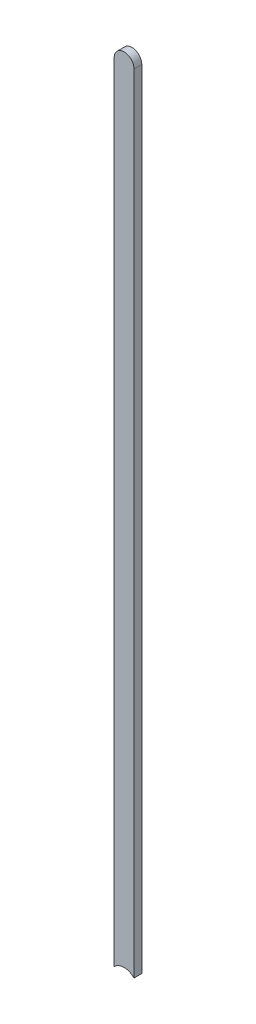
ISO-10303-21;
HEADER;
FILE_DESCRIPTION(('STEP AP214'),'2;1');
FILE_NAME('part.step','',(''),(''),'','','');
FILE_SCHEMA(('AUTOMOTIVE_DESIGN { 1 0 10303 214 1 1 1 1 }'));
ENDSEC;
DATA;
#1=APPLICATION_CONTEXT('core data for automotive mechanical design processes');
#2=APPLICATION_PROTOCOL_DEFINITION('international standard','automotive_design',2000,#1);
#3=PRODUCT_CONTEXT('',#1,'mechanical');
#4=PRODUCT('Part','Part','',(#3));
#5=PRODUCT_RELATED_PRODUCT_CATEGORY('part','',(#4));
#6=PRODUCT_DEFINITION_FORMATION('','',#4);
#7=PRODUCT_DEFINITION_CONTEXT('part definition',#1,'design');
#8=PRODUCT_DEFINITION('design','',#6,#7);
#9=PRODUCT_DEFINITION_SHAPE('','',#8);
#10=(LENGTH_UNIT() NAMED_UNIT(*) SI_UNIT(.MILLI.,.METRE.));
#11=(NAMED_UNIT(*) PLANE_ANGLE_UNIT() SI_UNIT($,.RADIAN.));
#12=(NAMED_UNIT(*) SI_UNIT($,.STERADIAN.) SOLID_ANGLE_UNIT());
#13=UNCERTAINTY_MEASURE_WITH_UNIT(LENGTH_MEASURE(1.E-05),#10,'distance_accuracy_value','');
#14=(GEOMETRIC_REPRESENTATION_CONTEXT(3) GLOBAL_UNCERTAINTY_ASSIGNED_CONTEXT((#13)) GLOBAL_UNIT_ASSIGNED_CONTEXT((#10,
#11,#12)) REPRESENTATION_CONTEXT('',''));
#15=CARTESIAN_POINT('',(0.,0.,0.));
#16=DIRECTION('',(0.,0.,1.));
#17=DIRECTION('',(1.,0.,0.));
#18=AXIS2_PLACEMENT_3D('',#15,#16,#17);
#19=CARTESIAN_POINT('',(126.4666,68.0668681578668,0.));
#20=DIRECTION('',(-1.,0.,0.));
#21=DIRECTION('',(0.,1.,0.));
#22=AXIS2_PLACEMENT_3D('',#19,#20,#21);
#23=PLANE('',#22);
#24=DIRECTION('',(0.,1.,0.));
#25=VECTOR('',#24,1.);
#26=CARTESIAN_POINT('',(126.4666,67.818,0.1999996));
#27=LINE('',#26,#25);
#28=CARTESIAN_POINT('',(126.4666,68.0668681578668,0.1999996));
#29=VERTEX_POINT('',#28);
#30=CARTESIAN_POINT('',(126.4666,88.2468644,0.1999996));
#31=VERTEX_POINT('',#30);
#32=EDGE_CURVE('E11',#29,#31,#27,.T.);
#33=ORIENTED_EDGE('',*,*,#32,.F.);
#34=DIRECTION('',(0.,0.,1.));
#35=VECTOR('',#34,1.);
#36=CARTESIAN_POINT('',(126.4666,68.0668681578668,0.));
#37=LINE('',#36,#35);
#38=CARTESIAN_POINT('',(126.4666,68.0668681578668,0.));
#39=VERTEX_POINT('',#38);
#40=EDGE_CURVE('E24',#39,#29,#37,.T.);
#41=ORIENTED_EDGE('',*,*,#40,.F.);
#42=DIRECTION('',(0.,1.,0.));
#43=VECTOR('',#42,1.);
#44=CARTESIAN_POINT('',(126.4666,67.818,0.));
#45=LINE('',#44,#43);
#46=CARTESIAN_POINT('',(126.4666,88.2468644,0.));
#47=VERTEX_POINT('',#46);
#48=EDGE_CURVE('E75',#39,#47,#45,.T.);
#49=ORIENTED_EDGE('',*,*,#48,.T.);
#50=DIRECTION('',(0.,0.,1.));
#51=VECTOR('',#50,1.);
#52=CARTESIAN_POINT('',(126.4666,88.2468644,0.));
#53=LINE('',#52,#51);
#54=EDGE_CURVE('E37',#47,#31,#53,.T.);
#55=ORIENTED_EDGE('',*,*,#54,.T.);
#56=EDGE_LOOP('',(#33,#41,#49,#55));
#57=FACE_BOUND('',#56,.T.);
#58=ADVANCED_FACE('F17',(#57),#23,.F.);
#59=CARTESIAN_POINT('',(126.2126,88.2468644,0.));
#60=DIRECTION('',(0.,0.,-1.));
#61=DIRECTION('',(1.,0.,0.));
#62=AXIS2_PLACEMENT_3D('',#59,#60,#61);
#63=CYLINDRICAL_SURFACE('',#62,0.253999999999995);
#64=CARTESIAN_POINT('',(126.2126,88.2468644,0.1999996));
#65=DIRECTION('',(0.,0.,1.));
#66=DIRECTION('',(1.,0.,0.));
#67=AXIS2_PLACEMENT_3D('',#64,#65,#66);
#68=CIRCLE('',#67,0.253999999999995);
#69=CARTESIAN_POINT('',(125.9586,88.2468644,0.1999996));
#70=VERTEX_POINT('',#69);
#71=EDGE_CURVE('E83',#31,#70,#68,.T.);
#72=ORIENTED_EDGE('',*,*,#71,.F.);
#73=ORIENTED_EDGE('',*,*,#54,.F.);
#74=CARTESIAN_POINT('',(126.2126,88.2468644,0.));
#75=DIRECTION('',(0.,0.,1.));
#76=DIRECTION('',(1.,0.,0.));
#77=AXIS2_PLACEMENT_3D('',#74,#75,#76);
#78=CIRCLE('',#77,0.253999999999995);
#79=CARTESIAN_POINT('',(125.9586,88.2468644,0.));
#80=VERTEX_POINT('',#79);
#81=EDGE_CURVE('E81',#47,#80,#78,.T.);
#82=ORIENTED_EDGE('',*,*,#81,.T.);
#83=DIRECTION('',(0.,0.,1.));
#84=VECTOR('',#83,1.);
#85=CARTESIAN_POINT('',(125.9586,88.2468644,0.));
#86=LINE('',#85,#84);
#87=EDGE_CURVE('E67',#80,#70,#86,.T.);
#88=ORIENTED_EDGE('',*,*,#87,.T.);
#89=EDGE_LOOP('',(#72,#73,#82,#88));
#90=FACE_BOUND('',#89,.T.);
#91=ADVANCED_FACE('F89',(#90),#63,.T.);
#92=CARTESIAN_POINT('',(125.9586,88.2468644,0.));
#93=DIRECTION('',(1.,0.,0.));
#94=DIRECTION('',(0.,-1.,0.));
#95=AXIS2_PLACEMENT_3D('',#92,#93,#94);
#96=PLANE('',#95);
#97=DIRECTION('',(0.,-1.,0.));
#98=VECTOR('',#97,1.);
#99=CARTESIAN_POINT('',(125.9586,88.2468644,0.1999996));
#100=LINE('',#99,#98);
#101=CARTESIAN_POINT('',(125.9586,68.0668681578668,0.1999996));
#102=VERTEX_POINT('',#101);
#103=EDGE_CURVE('E71',#70,#102,#100,.T.);
#104=ORIENTED_EDGE('',*,*,#103,.F.);
#105=ORIENTED_EDGE('',*,*,#87,.F.);
#106=DIRECTION('',(0.,-1.,0.));
#107=VECTOR('',#106,1.);
#108=CARTESIAN_POINT('',(125.9586,88.2468644,0.));
#109=LINE('',#108,#107);
#110=CARTESIAN_POINT('',(125.9586,68.0668681578668,0.));
#111=VERTEX_POINT('',#110);
#112=EDGE_CURVE('E63',#80,#111,#109,.T.);
#113=ORIENTED_EDGE('',*,*,#112,.T.);
#114=DIRECTION('',(0.,0.,1.));
#115=VECTOR('',#114,1.);
#116=CARTESIAN_POINT('',(125.9586,68.0668681578668,0.));
#117=LINE('',#116,#115);
#118=EDGE_CURVE('E53',#111,#102,#117,.T.);
#119=ORIENTED_EDGE('',*,*,#118,.T.);
#120=EDGE_LOOP('',(#104,#105,#113,#119));
#121=FACE_BOUND('',#120,.T.);
#122=ADVANCED_FACE('F66',(#121),#96,.F.);
#123=CARTESIAN_POINT('',(126.2126,67.818,0.));
#124=DIRECTION('',(0.,0.,-1.));
#125=DIRECTION('',(1.,0.,0.));
#126=AXIS2_PLACEMENT_3D('',#123,#124,#125);
#127=CYLINDRICAL_SURFACE('',#126,0.3556);
#128=ORIENTED_EDGE('',*,*,#40,.T.);
#129=CARTESIAN_POINT('',(126.2126,67.818,0.1999996));
#130=DIRECTION('',(0.,0.,1.));
#131=DIRECTION('',(1.,0.,0.));
#132=AXIS2_PLACEMENT_3D('',#129,#130,#131);
#133=CIRCLE('',#132,0.3556);
#134=EDGE_CURVE('E59',#29,#102,#133,.T.);
#135=ORIENTED_EDGE('',*,*,#134,.T.);
#136=ORIENTED_EDGE('',*,*,#118,.F.);
#137=CARTESIAN_POINT('',(126.2126,67.818,0.));
#138=DIRECTION('',(0.,0.,1.));
#139=DIRECTION('',(1.,0.,0.));
#140=AXIS2_PLACEMENT_3D('',#137,#138,#139);
#141=CIRCLE('',#140,0.3556);
#142=EDGE_CURVE('E57',#39,#111,#141,.T.);
#143=ORIENTED_EDGE('',*,*,#142,.F.);
#144=EDGE_LOOP('',(#128,#135,#136,#143));
#145=FACE_BOUND('',#144,.T.);
#146=ADVANCED_FACE('F55',(#145),#127,.F.);
#147=CARTESIAN_POINT('',(126.4666,67.818,0.));
#148=DIRECTION('',(0.,0.,-1.));
#149=DIRECTION('',(-1.,0.,0.));
#150=AXIS2_PLACEMENT_3D('',#147,#148,#149);
#151=PLANE('',#150);
#152=ORIENTED_EDGE('',*,*,#48,.F.);
#153=ORIENTED_EDGE('',*,*,#142,.T.);
#154=ORIENTED_EDGE('',*,*,#112,.F.);
#155=ORIENTED_EDGE('',*,*,#81,.F.);
#156=EDGE_LOOP('',(#152,#153,#154,#155));
#157=FACE_BOUND('',#156,.T.);
#158=ADVANCED_FACE('F74',(#157),#151,.T.);
#159=CARTESIAN_POINT('',(126.4666,67.818,0.1999996));
#160=DIRECTION('',(0.,0.,-1.));
#161=DIRECTION('',(-1.,0.,0.));
#162=AXIS2_PLACEMENT_3D('',#159,#160,#161);
#163=PLANE('',#162);
#164=ORIENTED_EDGE('',*,*,#134,.F.);
#165=ORIENTED_EDGE('',*,*,#32,.T.);
#166=ORIENTED_EDGE('',*,*,#71,.T.);
#167=ORIENTED_EDGE('',*,*,#103,.T.);
#168=EDGE_LOOP('',(#164,#165,#166,#167));
#169=FACE_BOUND('',#168,.T.);
#170=ADVANCED_FACE('F91',(#169),#163,.F.);
#171=CLOSED_SHELL('',(#58,#91,#122,#146,#158,#170));
#172=MANIFOLD_SOLID_BREP('B1',#171);
#173=ADVANCED_BREP_SHAPE_REPRESENTATION('',(#18,#172),#14);
#174=SHAPE_DEFINITION_REPRESENTATION(#9,#173);
ENDSEC;
END-ISO-10303-21;
